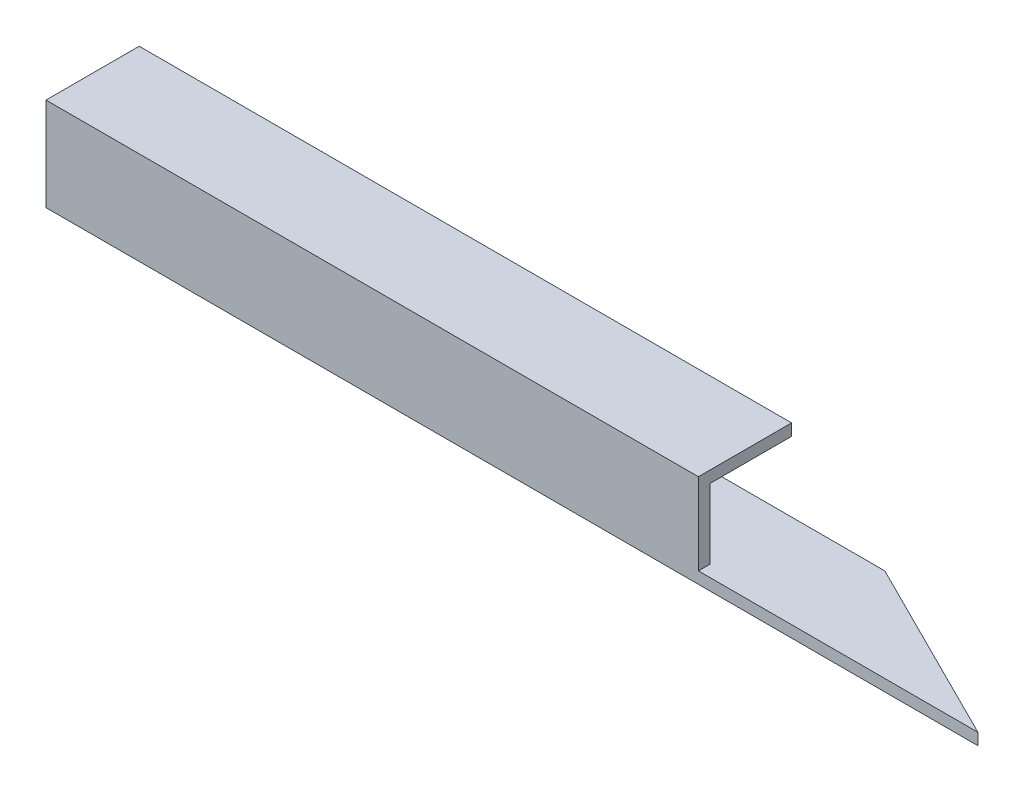
ISO-10303-21;
HEADER;
FILE_DESCRIPTION(('STEP AP214'),'2;1');
FILE_NAME('part.step','',(''),(''),'','','');
FILE_SCHEMA(('AUTOMOTIVE_DESIGN { 1 0 10303 214 1 1 1 1 }'));
ENDSEC;
DATA;
#1=APPLICATION_CONTEXT('core data for automotive mechanical design processes');
#2=APPLICATION_PROTOCOL_DEFINITION('international standard','automotive_design',2000,#1);
#3=PRODUCT_CONTEXT('',#1,'mechanical');
#4=PRODUCT('Part','Part','',(#3));
#5=PRODUCT_RELATED_PRODUCT_CATEGORY('part','',(#4));
#6=PRODUCT_DEFINITION_FORMATION('','',#4);
#7=PRODUCT_DEFINITION_CONTEXT('part definition',#1,'design');
#8=PRODUCT_DEFINITION('design','',#6,#7);
#9=PRODUCT_DEFINITION_SHAPE('','',#8);
#10=(LENGTH_UNIT() NAMED_UNIT(*) SI_UNIT(.MILLI.,.METRE.));
#11=(NAMED_UNIT(*) PLANE_ANGLE_UNIT() SI_UNIT($,.RADIAN.));
#12=(NAMED_UNIT(*) SI_UNIT($,.STERADIAN.) SOLID_ANGLE_UNIT());
#13=UNCERTAINTY_MEASURE_WITH_UNIT(LENGTH_MEASURE(1.E-05),#10,'distance_accuracy_value','');
#14=(GEOMETRIC_REPRESENTATION_CONTEXT(3) GLOBAL_UNCERTAINTY_ASSIGNED_CONTEXT((#13)) GLOBAL_UNIT_ASSIGNED_CONTEXT((#10,
#11,#12)) REPRESENTATION_CONTEXT('',''));
#15=CARTESIAN_POINT('',(0.,0.,0.));
#16=DIRECTION('',(0.,0.,1.));
#17=DIRECTION('',(1.,0.,0.));
#18=AXIS2_PLACEMENT_3D('',#15,#16,#17);
#19=CARTESIAN_POINT('',(0.,25.4,-5.77524006940657));
#20=DIRECTION('',(0.,0.,-1.));
#21=DIRECTION('',(-1.,0.,0.));
#22=AXIS2_PLACEMENT_3D('',#19,#20,#21);
#23=PLANE('',#22);
#24=DIRECTION('',(0.,-1.,0.));
#25=VECTOR('',#24,1.);
#26=CARTESIAN_POINT('',(-78.6404926388968,25.4,-5.77524006940657));
#27=LINE('',#26,#25);
#28=CARTESIAN_POINT('',(-78.6404926388968,3.175,-5.77524006940657));
#29=VERTEX_POINT('',#28);
#30=CARTESIAN_POINT('',(-78.6404926388968,0.,-5.77524006940657));
#31=VERTEX_POINT('',#30);
#32=EDGE_CURVE('E128',#29,#31,#27,.T.);
#33=ORIENTED_EDGE('',*,*,#32,.F.);
#34=DIRECTION('',(-1.,0.,0.));
#35=VECTOR('',#34,1.);
#36=CARTESIAN_POINT('',(0.,3.175,-5.77524006940657));
#37=LINE('',#36,#35);
#38=CARTESIAN_POINT('',(124.559507361103,3.175,-5.77524006940657));
#39=VERTEX_POINT('',#38);
#40=EDGE_CURVE('E158',#39,#29,#37,.T.);
#41=ORIENTED_EDGE('',*,*,#40,.F.);
#42=DIRECTION('',(0.,-1.,0.));
#43=VECTOR('',#42,1.);
#44=CARTESIAN_POINT('',(124.559507361103,25.4,-5.77524006940657));
#45=LINE('',#44,#43);
#46=CARTESIAN_POINT('',(124.559507361103,0.,-5.77524006940657));
#47=VERTEX_POINT('',#46);
#48=EDGE_CURVE('E127',#39,#47,#45,.T.);
#49=ORIENTED_EDGE('',*,*,#48,.T.);
#50=DIRECTION('',(1.,0.,0.));
#51=VECTOR('',#50,1.);
#52=CARTESIAN_POINT('',(0.,0.,-5.77524006940657));
#53=LINE('',#52,#51);
#54=EDGE_CURVE('E134',#31,#47,#53,.T.);
#55=ORIENTED_EDGE('',*,*,#54,.F.);
#56=EDGE_LOOP('',(#33,#41,#49,#55));
#57=FACE_BOUND('',#56,.T.);
#58=ADVANCED_FACE('F35',(#57),#23,.T.);
#59=CARTESIAN_POINT('',(0.,25.4,19.6247599305934));
#60=DIRECTION('',(0.,0.,-1.));
#61=DIRECTION('',(-1.,0.,0.));
#62=AXIS2_PLACEMENT_3D('',#59,#60,#61);
#63=PLANE('',#62);
#64=DIRECTION('',(0.,1.,0.));
#65=VECTOR('',#64,1.);
#66=CARTESIAN_POINT('',(99.1595073611032,3.175,19.6247599305934));
#67=LINE('',#66,#65);
#68=CARTESIAN_POINT('',(99.1595073611032,3.175,19.6247599305934));
#69=VERTEX_POINT('',#68);
#70=CARTESIAN_POINT('',(99.1595073611032,25.4,19.6247599305934));
#71=VERTEX_POINT('',#70);
#72=EDGE_CURVE('E186',#69,#71,#67,.T.);
#73=ORIENTED_EDGE('',*,*,#72,.T.);
#74=DIRECTION('',(1.,0.,0.));
#75=VECTOR('',#74,1.);
#76=CARTESIAN_POINT('',(0.,25.4,19.6247599305934));
#77=LINE('',#76,#75);
#78=CARTESIAN_POINT('',(-78.6404926388968,25.4,19.6247599305934));
#79=VERTEX_POINT('',#78);
#80=EDGE_CURVE('E176',#79,#71,#77,.T.);
#81=ORIENTED_EDGE('',*,*,#80,.F.);
#82=DIRECTION('',(0.,-1.,0.));
#83=VECTOR('',#82,1.);
#84=CARTESIAN_POINT('',(-78.6404926388968,25.4,19.6247599305934));
#85=LINE('',#84,#83);
#86=CARTESIAN_POINT('',(-78.6404926388968,0.,19.6247599305934));
#87=VERTEX_POINT('',#86);
#88=EDGE_CURVE('E138',#79,#87,#85,.T.);
#89=ORIENTED_EDGE('',*,*,#88,.T.);
#90=DIRECTION('',(1.,0.,0.));
#91=VECTOR('',#90,1.);
#92=CARTESIAN_POINT('',(0.,0.,19.6247599305934));
#93=LINE('',#92,#91);
#94=CARTESIAN_POINT('',(175.359507361103,0.,19.6247599305934));
#95=VERTEX_POINT('',#94);
#96=EDGE_CURVE('E161',#87,#95,#93,.T.);
#97=ORIENTED_EDGE('',*,*,#96,.T.);
#98=DIRECTION('',(0.,-1.,0.));
#99=VECTOR('',#98,1.);
#100=CARTESIAN_POINT('',(175.359507361103,25.4,19.6247599305934));
#101=LINE('',#100,#99);
#102=CARTESIAN_POINT('',(175.359507361103,3.175,19.6247599305935));
#103=VERTEX_POINT('',#102);
#104=EDGE_CURVE('E130',#103,#95,#101,.T.);
#105=ORIENTED_EDGE('',*,*,#104,.F.);
#106=DIRECTION('',(1.,0.,0.));
#107=VECTOR('',#106,1.);
#108=CARTESIAN_POINT('',(0.,3.175,19.6247599305934));
#109=LINE('',#108,#107);
#110=EDGE_CURVE('E152',#69,#103,#109,.T.);
#111=ORIENTED_EDGE('',*,*,#110,.F.);
#112=EDGE_LOOP('',(#73,#81,#89,#97,#105,#111));
#113=FACE_BOUND('',#112,.T.);
#114=ADVANCED_FACE('F160',(#113),#63,.F.);
#115=CARTESIAN_POINT('',(27.2219974999833,25.4,-54.4439949999665));
#116=DIRECTION('',(-0.447213595499958,0.,0.894427190999916));
#117=DIRECTION('',(0.894427190999916,0.,0.447213595499958));
#118=AXIS2_PLACEMENT_3D('',#115,#116,#117);
#119=PLANE('',#118);
#120=DIRECTION('',(0.894427190999916,0.,0.447213595499958));
#121=VECTOR('',#120,1.);
#122=CARTESIAN_POINT('',(27.2219974999833,3.175,-54.4439949999665));
#123=LINE('',#122,#121);
#124=EDGE_CURVE('E43',#39,#103,#123,.T.);
#125=ORIENTED_EDGE('',*,*,#124,.T.);
#126=ORIENTED_EDGE('',*,*,#104,.T.);
#127=DIRECTION('',(-0.894427190999916,0.,-0.447213595499958));
#128=VECTOR('',#127,1.);
#129=CARTESIAN_POINT('',(27.2219974999833,0.,-54.4439949999665));
#130=LINE('',#129,#128);
#131=EDGE_CURVE('E166',#95,#47,#130,.T.);
#132=ORIENTED_EDGE('',*,*,#131,.T.);
#133=ORIENTED_EDGE('',*,*,#48,.F.);
#134=EDGE_LOOP('',(#125,#126,#132,#133));
#135=FACE_BOUND('',#134,.T.);
#136=ADVANCED_FACE('F143',(#135),#119,.F.);
#137=DIRECTION('',(1.,0.,0.));
#138=VECTOR('',#137,1.);
#139=CARTESIAN_POINT('',(0.,22.225,-5.77524006940657));
#140=LINE('',#139,#138);
#141=CARTESIAN_POINT('',(-78.6404926388968,22.225,-5.77524006940657));
#142=VERTEX_POINT('',#141);
#143=CARTESIAN_POINT('',(99.1595073611032,22.225,-5.77524006940657));
#144=VERTEX_POINT('',#143);
#145=EDGE_CURVE('E104',#142,#144,#140,.T.);
#146=ORIENTED_EDGE('',*,*,#145,.F.);
#147=CARTESIAN_POINT('',(-78.6404926388968,25.4,-5.77524006940657));
#148=VERTEX_POINT('',#147);
#149=EDGE_CURVE('E118',#148,#142,#27,.T.);
#150=ORIENTED_EDGE('',*,*,#149,.F.);
#151=DIRECTION('',(1.,0.,0.));
#152=VECTOR('',#151,1.);
#153=CARTESIAN_POINT('',(0.,25.4,-5.77524006940657));
#154=LINE('',#153,#152);
#155=CARTESIAN_POINT('',(99.1595073611032,25.4,-5.77524006940657));
#156=VERTEX_POINT('',#155);
#157=EDGE_CURVE('E132',#148,#156,#154,.T.);
#158=ORIENTED_EDGE('',*,*,#157,.T.);
#159=DIRECTION('',(0.,1.,0.));
#160=VECTOR('',#159,1.);
#161=CARTESIAN_POINT('',(99.1595073611032,3.175,-5.77524006940657));
#162=LINE('',#161,#160);
#163=EDGE_CURVE('E120',#144,#156,#162,.T.);
#164=ORIENTED_EDGE('',*,*,#163,.F.);
#165=EDGE_LOOP('',(#146,#150,#158,#164));
#166=FACE_BOUND('',#165,.T.);
#167=ADVANCED_FACE('F116',(#166),#23,.T.);
#168=CARTESIAN_POINT('',(0.,25.4,0.));
#169=DIRECTION('',(0.,1.,0.));
#170=DIRECTION('',(0.,0.,1.));
#171=AXIS2_PLACEMENT_3D('',#168,#169,#170);
#172=PLANE('',#171);
#173=ORIENTED_EDGE('',*,*,#80,.T.);
#174=DIRECTION('',(0.,0.,-1.));
#175=VECTOR('',#174,1.);
#176=CARTESIAN_POINT('',(99.1595073611032,25.4,0.));
#177=LINE('',#176,#175);
#178=EDGE_CURVE('E121',#71,#156,#177,.T.);
#179=ORIENTED_EDGE('',*,*,#178,.T.);
#180=ORIENTED_EDGE('',*,*,#157,.F.);
#181=DIRECTION('',(0.,0.,1.));
#182=VECTOR('',#181,1.);
#183=CARTESIAN_POINT('',(-78.6404926388968,25.4,0.));
#184=LINE('',#183,#182);
#185=EDGE_CURVE('E125',#148,#79,#184,.T.);
#186=ORIENTED_EDGE('',*,*,#185,.T.);
#187=EDGE_LOOP('',(#173,#179,#180,#186));
#188=FACE_BOUND('',#187,.T.);
#189=ADVANCED_FACE('F205',(#188),#172,.T.);
#190=CARTESIAN_POINT('',(175.359507361103,3.175,16.4497599305934));
#191=DIRECTION('',(0.,0.,1.));
#192=DIRECTION('',(1.,0.,0.));
#193=AXIS2_PLACEMENT_3D('',#190,#191,#192);
#194=PLANE('',#193);
#195=DIRECTION('',(0.,1.,0.));
#196=VECTOR('',#195,1.);
#197=CARTESIAN_POINT('',(99.1595073611032,3.175,16.4497599305934));
#198=LINE('',#197,#196);
#199=CARTESIAN_POINT('',(99.1595073611032,3.175,16.4497599305934));
#200=VERTEX_POINT('',#199);
#201=CARTESIAN_POINT('',(99.1595073611032,22.225,16.4497599305934));
#202=VERTEX_POINT('',#201);
#203=EDGE_CURVE('E53',#200,#202,#198,.T.);
#204=ORIENTED_EDGE('',*,*,#203,.F.);
#205=DIRECTION('',(-1.,0.,0.));
#206=VECTOR('',#205,1.);
#207=CARTESIAN_POINT('',(175.359507361103,3.175,16.4497599305934));
#208=LINE('',#207,#206);
#209=CARTESIAN_POINT('',(-78.6404926388968,3.175,16.4497599305934));
#210=VERTEX_POINT('',#209);
#211=EDGE_CURVE('E174',#200,#210,#208,.T.);
#212=ORIENTED_EDGE('',*,*,#211,.T.);
#213=DIRECTION('',(0.,1.,0.));
#214=VECTOR('',#213,1.);
#215=CARTESIAN_POINT('',(-78.6404926388968,3.175,16.4497599305934));
#216=LINE('',#215,#214);
#217=CARTESIAN_POINT('',(-78.6404926388968,22.225,16.4497599305934));
#218=VERTEX_POINT('',#217);
#219=EDGE_CURVE('E113',#210,#218,#216,.T.);
#220=ORIENTED_EDGE('',*,*,#219,.T.);
#221=DIRECTION('',(-1.,0.,0.));
#222=VECTOR('',#221,1.);
#223=CARTESIAN_POINT('',(175.359507361103,22.225,16.4497599305934));
#224=LINE('',#223,#222);
#225=EDGE_CURVE('E107',#202,#218,#224,.T.);
#226=ORIENTED_EDGE('',*,*,#225,.F.);
#227=EDGE_LOOP('',(#204,#212,#220,#226));
#228=FACE_BOUND('',#227,.T.);
#229=ADVANCED_FACE('F194',(#228),#194,.F.);
#230=CARTESIAN_POINT('',(175.359507361103,22.225,-2.60024006940657));
#231=DIRECTION('',(0.,1.,0.));
#232=DIRECTION('',(0.,0.,1.));
#233=AXIS2_PLACEMENT_3D('',#230,#231,#232);
#234=PLANE('',#233);
#235=DIRECTION('',(0.,0.,-1.));
#236=VECTOR('',#235,1.);
#237=CARTESIAN_POINT('',(99.1595073611032,22.225,-2.60024006940661));
#238=LINE('',#237,#236);
#239=EDGE_CURVE('E11',#202,#144,#238,.T.);
#240=ORIENTED_EDGE('',*,*,#239,.F.);
#241=ORIENTED_EDGE('',*,*,#225,.T.);
#242=DIRECTION('',(0.,0.,-1.));
#243=VECTOR('',#242,1.);
#244=CARTESIAN_POINT('',(-78.6404926388968,22.225,-2.60024006940657));
#245=LINE('',#244,#243);
#246=EDGE_CURVE('E101',#218,#142,#245,.T.);
#247=ORIENTED_EDGE('',*,*,#246,.T.);
#248=ORIENTED_EDGE('',*,*,#145,.T.);
#249=EDGE_LOOP('',(#240,#241,#247,#248));
#250=FACE_BOUND('',#249,.T.);
#251=ADVANCED_FACE('F103',(#250),#234,.F.);
#252=CARTESIAN_POINT('',(-78.6404926388968,25.4,0.));
#253=DIRECTION('',(1.,0.,0.));
#254=DIRECTION('',(0.,0.,-1.));
#255=AXIS2_PLACEMENT_3D('',#252,#253,#254);
#256=PLANE('',#255);
#257=DIRECTION('',(0.,0.,1.));
#258=VECTOR('',#257,1.);
#259=CARTESIAN_POINT('',(-78.6404926388968,3.175,-2.60024006940657));
#260=LINE('',#259,#258);
#261=EDGE_CURVE('E112',#29,#210,#260,.T.);
#262=ORIENTED_EDGE('',*,*,#261,.F.);
#263=ORIENTED_EDGE('',*,*,#32,.T.);
#264=DIRECTION('',(0.,0.,1.));
#265=VECTOR('',#264,1.);
#266=CARTESIAN_POINT('',(-78.6404926388968,0.,0.));
#267=LINE('',#266,#265);
#268=EDGE_CURVE('E167',#31,#87,#267,.T.);
#269=ORIENTED_EDGE('',*,*,#268,.T.);
#270=ORIENTED_EDGE('',*,*,#88,.F.);
#271=ORIENTED_EDGE('',*,*,#185,.F.);
#272=ORIENTED_EDGE('',*,*,#149,.T.);
#273=ORIENTED_EDGE('',*,*,#246,.F.);
#274=ORIENTED_EDGE('',*,*,#219,.F.);
#275=EDGE_LOOP('',(#262,#263,#269,#270,#271,#272,#273,#274));
#276=FACE_BOUND('',#275,.T.);
#277=ADVANCED_FACE('F37',(#276),#256,.F.);
#278=CARTESIAN_POINT('',(0.,0.,0.));
#279=DIRECTION('',(0.,1.,0.));
#280=DIRECTION('',(0.,0.,1.));
#281=AXIS2_PLACEMENT_3D('',#278,#279,#280);
#282=PLANE('',#281);
#283=ORIENTED_EDGE('',*,*,#268,.F.);
#284=ORIENTED_EDGE('',*,*,#54,.T.);
#285=ORIENTED_EDGE('',*,*,#131,.F.);
#286=ORIENTED_EDGE('',*,*,#96,.F.);
#287=EDGE_LOOP('',(#283,#284,#285,#286));
#288=FACE_BOUND('',#287,.T.);
#289=ADVANCED_FACE('F170',(#288),#282,.F.);
#290=CARTESIAN_POINT('',(175.359507361103,3.175,-2.60024006940657));
#291=DIRECTION('',(0.,-1.,0.));
#292=DIRECTION('',(0.,0.,-1.));
#293=AXIS2_PLACEMENT_3D('',#290,#291,#292);
#294=PLANE('',#293);
#295=ORIENTED_EDGE('',*,*,#40,.T.);
#296=ORIENTED_EDGE('',*,*,#261,.T.);
#297=ORIENTED_EDGE('',*,*,#211,.F.);
#298=DIRECTION('',(0.,0.,-1.));
#299=VECTOR('',#298,1.);
#300=CARTESIAN_POINT('',(99.1595073611032,3.175,0.));
#301=LINE('',#300,#299);
#302=EDGE_CURVE('E155',#69,#200,#301,.T.);
#303=ORIENTED_EDGE('',*,*,#302,.F.);
#304=ORIENTED_EDGE('',*,*,#110,.T.);
#305=ORIENTED_EDGE('',*,*,#124,.F.);
#306=EDGE_LOOP('',(#295,#296,#297,#303,#304,#305));
#307=FACE_BOUND('',#306,.T.);
#308=ADVANCED_FACE('F153',(#307),#294,.F.);
#309=CARTESIAN_POINT('',(99.1595073611032,3.175,0.));
#310=DIRECTION('',(1.,0.,0.));
#311=DIRECTION('',(0.,0.,-1.));
#312=AXIS2_PLACEMENT_3D('',#309,#310,#311);
#313=PLANE('',#312);
#314=ORIENTED_EDGE('',*,*,#239,.T.);
#315=ORIENTED_EDGE('',*,*,#163,.T.);
#316=ORIENTED_EDGE('',*,*,#178,.F.);
#317=ORIENTED_EDGE('',*,*,#72,.F.);
#318=ORIENTED_EDGE('',*,*,#302,.T.);
#319=ORIENTED_EDGE('',*,*,#203,.T.);
#320=EDGE_LOOP('',(#314,#315,#316,#317,#318,#319));
#321=FACE_BOUND('',#320,.T.);
#322=ADVANCED_FACE('F192',(#321),#313,.T.);
#323=CLOSED_SHELL('',(#58,#114,#136,#167,#189,#229,#251,#277,#289,#308,#322));
#324=MANIFOLD_SOLID_BREP('B2',#323);
#325=ADVANCED_BREP_SHAPE_REPRESENTATION('',(#18,#324),#14);
#326=SHAPE_DEFINITION_REPRESENTATION(#9,#325);
ENDSEC;
END-ISO-10303-21;
